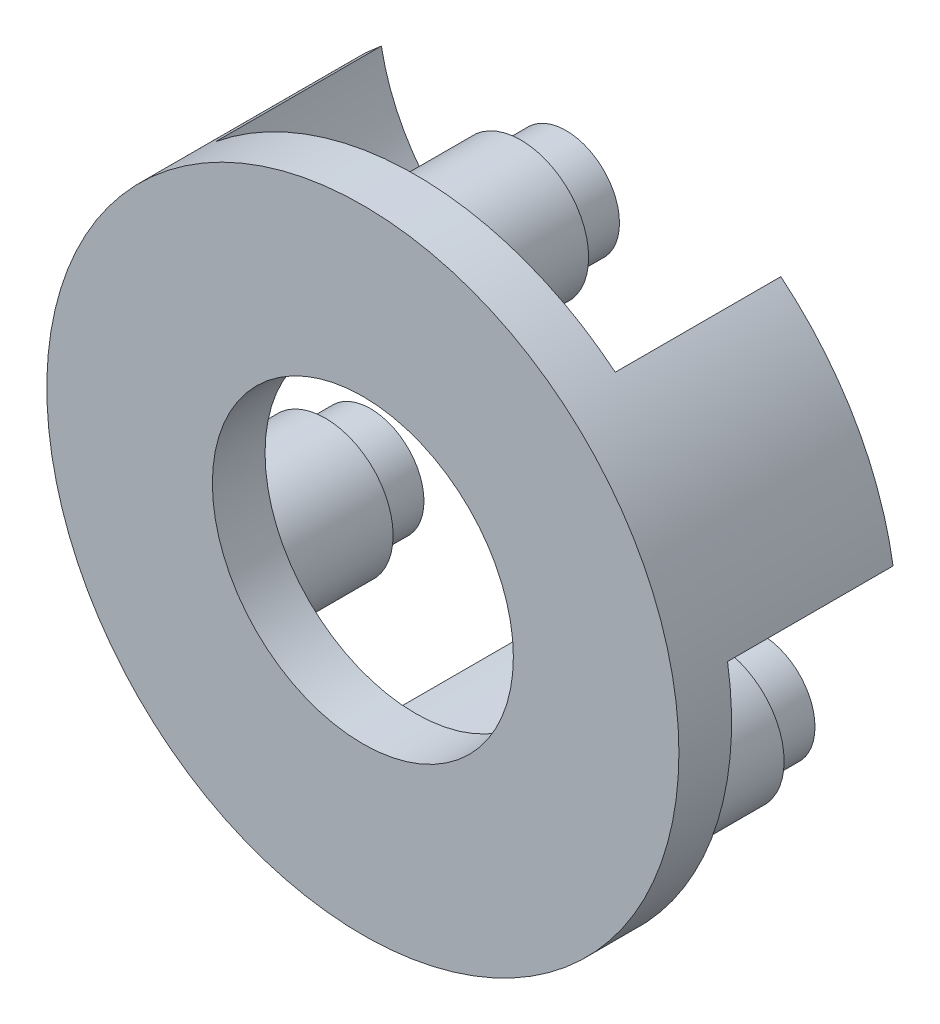
ISO-10303-21;
HEADER;
FILE_DESCRIPTION(('STEP AP214'),'2;1');
FILE_NAME('part.step','',(''),(''),'','','');
FILE_SCHEMA(('AUTOMOTIVE_DESIGN { 1 0 10303 214 1 1 1 1 }'));
ENDSEC;
DATA;
#1=APPLICATION_CONTEXT('core data for automotive mechanical design processes');
#2=APPLICATION_PROTOCOL_DEFINITION('international standard','automotive_design',2000,#1);
#3=PRODUCT_CONTEXT('',#1,'mechanical');
#4=PRODUCT('Part','Part','',(#3));
#5=PRODUCT_RELATED_PRODUCT_CATEGORY('part','',(#4));
#6=PRODUCT_DEFINITION_FORMATION('','',#4);
#7=PRODUCT_DEFINITION_CONTEXT('part definition',#1,'design');
#8=PRODUCT_DEFINITION('design','',#6,#7);
#9=PRODUCT_DEFINITION_SHAPE('','',#8);
#10=(LENGTH_UNIT() NAMED_UNIT(*) SI_UNIT(.MILLI.,.METRE.));
#11=(NAMED_UNIT(*) PLANE_ANGLE_UNIT() SI_UNIT($,.RADIAN.));
#12=(NAMED_UNIT(*) SI_UNIT($,.STERADIAN.) SOLID_ANGLE_UNIT());
#13=UNCERTAINTY_MEASURE_WITH_UNIT(LENGTH_MEASURE(1.E-05),#10,'distance_accuracy_value','');
#14=(GEOMETRIC_REPRESENTATION_CONTEXT(3) GLOBAL_UNCERTAINTY_ASSIGNED_CONTEXT((#13)) GLOBAL_UNIT_ASSIGNED_CONTEXT((#10,
#11,#12)) REPRESENTATION_CONTEXT('',''));
#15=CARTESIAN_POINT('',(0.,0.,0.));
#16=DIRECTION('',(0.,0.,1.));
#17=DIRECTION('',(1.,0.,0.));
#18=AXIS2_PLACEMENT_3D('',#15,#16,#17);
#19=CARTESIAN_POINT('',(0.,0.,0.));
#20=DIRECTION('',(0.,0.,1.));
#21=DIRECTION('',(1.,0.,0.));
#22=AXIS2_PLACEMENT_3D('',#19,#20,#21);
#23=PLANE('',#22);
#24=CARTESIAN_POINT('',(12.9903810567656,-7.50000000000055,0.));
#25=DIRECTION('',(0.,0.,1.));
#26=DIRECTION('',(1.,0.,0.));
#27=AXIS2_PLACEMENT_3D('',#24,#25,#26);
#28=CIRCLE('',#27,4.5000000000012);
#29=CARTESIAN_POINT('',(17.4903810567668,-7.50000000000055,0.));
#30=VERTEX_POINT('',#29);
#31=EDGE_CURVE('E11',#30,#30,#28,.F.);
#32=ORIENTED_EDGE('',*,*,#31,.F.);
#33=EDGE_LOOP('',(#32));
#34=FACE_BOUND('',#33,.T.);
#35=CARTESIAN_POINT('',(-12.9903810567675,-7.49999999999945,0.));
#36=DIRECTION('',(0.,0.,1.));
#37=DIRECTION('',(1.,0.,0.));
#38=AXIS2_PLACEMENT_3D('',#35,#36,#37);
#39=CIRCLE('',#38,4.50000000000082);
#40=CARTESIAN_POINT('',(-8.49038105676671,-7.49999999999945,0.));
#41=VERTEX_POINT('',#40);
#42=EDGE_CURVE('E246',#41,#41,#39,.F.);
#43=ORIENTED_EDGE('',*,*,#42,.F.);
#44=EDGE_LOOP('',(#43));
#45=FACE_BOUND('',#44,.T.);
#46=CARTESIAN_POINT('',(0.,15.,0.));
#47=DIRECTION('',(0.,0.,1.));
#48=DIRECTION('',(1.,0.,0.));
#49=AXIS2_PLACEMENT_3D('',#46,#47,#48);
#50=CIRCLE('',#49,4.5);
#51=CARTESIAN_POINT('',(4.5,15.,0.));
#52=VERTEX_POINT('',#51);
#53=EDGE_CURVE('E240',#52,#52,#50,.F.);
#54=ORIENTED_EDGE('',*,*,#53,.F.);
#55=EDGE_LOOP('',(#54));
#56=FACE_BOUND('',#55,.T.);
#57=CARTESIAN_POINT('',(0.,0.,0.));
#58=DIRECTION('',(0.,0.,-1.));
#59=DIRECTION('',(-1.,0.,0.));
#60=AXIS2_PLACEMENT_3D('',#57,#58,#59);
#61=CIRCLE('',#60,10.);
#62=CARTESIAN_POINT('',(-10.,0.,0.));
#63=VERTEX_POINT('',#62);
#64=EDGE_CURVE('E223',#63,#63,#61,.T.);
#65=ORIENTED_EDGE('',*,*,#64,.F.);
#66=EDGE_LOOP('',(#65));
#67=FACE_BOUND('',#66,.T.);
#68=CARTESIAN_POINT('',(0.,0.,0.));
#69=DIRECTION('',(0.,0.,-1.));
#70=DIRECTION('',(-1.,0.,0.));
#71=AXIS2_PLACEMENT_3D('',#68,#69,#70);
#72=CIRCLE('',#71,12.5);
#73=CARTESIAN_POINT('',(3.02191559121072,-12.1292219931699,0.));
#74=VERTEX_POINT('',#73);
#75=CARTESIAN_POINT('',(-3.02191559121221,-12.1292219931696,0.));
#76=VERTEX_POINT('',#75);
#77=EDGE_CURVE('E160',#74,#76,#72,.T.);
#78=ORIENTED_EDGE('',*,*,#77,.T.);
#79=CARTESIAN_POINT('',(-16.2379763209581,-9.37499999999878,0.));
#80=DIRECTION('',(0.,0.,-1.));
#81=DIRECTION('',(-1.,0.,0.));
#82=AXIS2_PLACEMENT_3D('',#79,#80,#81);
#83=CIRCLE('',#82,13.4999999999999);
#84=CARTESIAN_POINT('',(-7.45897050021628,-19.6306841214692,0.));
#85=VERTEX_POINT('',#84);
#86=EDGE_CURVE('E133',#76,#85,#83,.T.);
#87=ORIENTED_EDGE('',*,*,#86,.T.);
#88=CARTESIAN_POINT('',(0.,0.,0.));
#89=DIRECTION('',(0.,0.,1.));
#90=DIRECTION('',(1.,0.,0.));
#91=AXIS2_PLACEMENT_3D('',#88,#89,#90);
#92=CIRCLE('',#91,21.);
#93=CARTESIAN_POINT('',(-20.7301563929679,3.35568412147083,0.));
#94=VERTEX_POINT('',#93);
#95=EDGE_CURVE('E237',#94,#85,#92,.T.);
#96=ORIENTED_EDGE('',*,*,#95,.F.);
#97=CARTESIAN_POINT('',(-16.2379763209581,-9.37499999999878,0.));
#98=DIRECTION('',(0.,0.,-1.));
#99=DIRECTION('',(-1.,0.,0.));
#100=AXIS2_PLACEMENT_3D('',#97,#98,#99);
#101=CIRCLE('',#100,13.5);
#102=CARTESIAN_POINT('',(-12.0151721698315,3.44755532650412,0.));
#103=VERTEX_POINT('',#102);
#104=EDGE_CURVE('E62',#94,#103,#101,.T.);
#105=ORIENTED_EDGE('',*,*,#104,.T.);
#106=CARTESIAN_POINT('',(0.,0.,0.));
#107=DIRECTION('',(0.,0.,-1.));
#108=DIRECTION('',(-1.,0.,0.));
#109=AXIS2_PLACEMENT_3D('',#106,#107,#108);
#110=CIRCLE('',#109,12.5);
#111=CARTESIAN_POINT('',(-8.99325657861968,8.68166666666682,0.));
#112=VERTEX_POINT('',#111);
#113=EDGE_CURVE('E182',#103,#112,#110,.T.);
#114=ORIENTED_EDGE('',*,*,#113,.T.);
#115=CARTESIAN_POINT('',(1.09807996029332E-12,18.7499999999993,0.));
#116=DIRECTION('',(0.,0.,-1.));
#117=DIRECTION('',(-1.,0.,0.));
#118=AXIS2_PLACEMENT_3D('',#115,#116,#117);
#119=CIRCLE('',#118,13.5);
#120=CARTESIAN_POINT('',(-13.2711858927519,16.2750000000007,0.));
#121=VERTEX_POINT('',#120);
#122=EDGE_CURVE('E138',#112,#121,#119,.T.);
#123=ORIENTED_EDGE('',*,*,#122,.T.);
#124=CARTESIAN_POINT('',(13.2711858927538,16.2749999999991,0.));
#125=VERTEX_POINT('',#124);
#126=EDGE_CURVE('E234',#125,#121,#92,.T.);
#127=ORIENTED_EDGE('',*,*,#126,.F.);
#128=CARTESIAN_POINT('',(1.09807996029332E-12,18.7499999999993,0.));
#129=DIRECTION('',(0.,0.,-1.));
#130=DIRECTION('',(-1.,0.,0.));
#131=AXIS2_PLACEMENT_3D('',#128,#129,#130);
#132=CIRCLE('',#131,13.5);
#133=CARTESIAN_POINT('',(8.9932565786207,8.68166666666577,0.));
#134=VERTEX_POINT('',#133);
#135=EDGE_CURVE('E198',#125,#134,#132,.T.);
#136=ORIENTED_EDGE('',*,*,#135,.T.);
#137=CARTESIAN_POINT('',(0.,0.,0.));
#138=DIRECTION('',(0.,0.,-1.));
#139=DIRECTION('',(-1.,0.,0.));
#140=AXIS2_PLACEMENT_3D('',#137,#138,#139);
#141=CIRCLE('',#140,12.5);
#142=CARTESIAN_POINT('',(12.0151721698319,3.4475553265027,0.));
#143=VERTEX_POINT('',#142);
#144=EDGE_CURVE('E209',#134,#143,#141,.T.);
#145=ORIENTED_EDGE('',*,*,#144,.T.);
#146=CARTESIAN_POINT('',(16.237976320957,-9.37500000000068,0.));
#147=DIRECTION('',(0.,0.,-1.));
#148=DIRECTION('',(-1.,0.,0.));
#149=AXIS2_PLACEMENT_3D('',#146,#147,#148);
#150=CIRCLE('',#149,13.5);
#151=CARTESIAN_POINT('',(20.7301563929683,3.35568412146838,0.));
#152=VERTEX_POINT('',#151);
#153=EDGE_CURVE('E193',#143,#152,#150,.T.);
#154=ORIENTED_EDGE('',*,*,#153,.T.);
#155=CARTESIAN_POINT('',(7.45897050021399,-19.6306841214701,0.));
#156=VERTEX_POINT('',#155);
#157=EDGE_CURVE('E229',#156,#152,#92,.T.);
#158=ORIENTED_EDGE('',*,*,#157,.F.);
#159=CARTESIAN_POINT('',(16.237976320957,-9.37500000000068,0.));
#160=DIRECTION('',(0.,0.,-1.));
#161=DIRECTION('',(-1.,0.,0.));
#162=AXIS2_PLACEMENT_3D('',#159,#160,#161);
#163=CIRCLE('',#162,13.5);
#164=EDGE_CURVE('E54',#156,#74,#163,.T.);
#165=ORIENTED_EDGE('',*,*,#164,.T.);
#166=EDGE_LOOP('',(#78,#87,#96,#105,#114,#123,#127,#136,#145,#154,#158,#165));
#167=FACE_BOUND('',#166,.T.);
#168=ADVANCED_FACE('F39',(#34,#45,#56,#67,#167),#23,.F.);
#169=CARTESIAN_POINT('',(0.,0.,3.5));
#170=DIRECTION('',(0.,0.,-1.));
#171=DIRECTION('',(-1.,0.,0.));
#172=AXIS2_PLACEMENT_3D('',#169,#170,#171);
#173=CYLINDRICAL_SURFACE('',#172,21.);
#174=CARTESIAN_POINT('',(0.,0.,3.5));
#175=DIRECTION('',(0.,0.,1.));
#176=DIRECTION('',(1.,0.,0.));
#177=AXIS2_PLACEMENT_3D('',#174,#175,#176);
#178=CIRCLE('',#177,21.);
#179=CARTESIAN_POINT('',(21.,0.,3.5));
#180=VERTEX_POINT('',#179);
#181=EDGE_CURVE('E230',#180,#180,#178,.T.);
#182=ORIENTED_EDGE('',*,*,#181,.F.);
#183=EDGE_LOOP('',(#182));
#184=FACE_BOUND('',#183,.T.);
#185=ORIENTED_EDGE('',*,*,#126,.T.);
#186=DIRECTION('',(0.,0.,1.));
#187=VECTOR('',#186,1.);
#188=CARTESIAN_POINT('',(-13.2711858927519,16.2750000000007,-11.));
#189=LINE('',#188,#187);
#190=CARTESIAN_POINT('',(-13.2711858927519,16.2750000000007,-11.));
#191=VERTEX_POINT('',#190);
#192=EDGE_CURVE('E179',#191,#121,#189,.T.);
#193=ORIENTED_EDGE('',*,*,#192,.F.);
#194=CARTESIAN_POINT('',(0.,0.,-11.));
#195=DIRECTION('',(0.,0.,-1.));
#196=DIRECTION('',(-1.,0.,0.));
#197=AXIS2_PLACEMENT_3D('',#194,#195,#196);
#198=CIRCLE('',#197,21.);
#199=CARTESIAN_POINT('',(-20.7301563929679,3.35568412147083,-11.));
#200=VERTEX_POINT('',#199);
#201=EDGE_CURVE('E177',#200,#191,#198,.T.);
#202=ORIENTED_EDGE('',*,*,#201,.F.);
#203=DIRECTION('',(0.,0.,1.));
#204=VECTOR('',#203,1.);
#205=CARTESIAN_POINT('',(-20.7301563929679,3.35568412147083,-11.));
#206=LINE('',#205,#204);
#207=EDGE_CURVE('E187',#200,#94,#206,.T.);
#208=ORIENTED_EDGE('',*,*,#207,.T.);
#209=ORIENTED_EDGE('',*,*,#95,.T.);
#210=DIRECTION('',(0.,0.,1.));
#211=VECTOR('',#210,1.);
#212=CARTESIAN_POINT('',(-7.45897050021628,-19.6306841214692,-11.));
#213=LINE('',#212,#211);
#214=CARTESIAN_POINT('',(-7.45897050021628,-19.6306841214692,-11.));
#215=VERTEX_POINT('',#214);
#216=EDGE_CURVE('E158',#215,#85,#213,.T.);
#217=ORIENTED_EDGE('',*,*,#216,.F.);
#218=CARTESIAN_POINT('',(0.,0.,-11.));
#219=DIRECTION('',(0.,0.,-1.));
#220=DIRECTION('',(-1.,0.,0.));
#221=AXIS2_PLACEMENT_3D('',#218,#219,#220);
#222=CIRCLE('',#221,21.);
#223=CARTESIAN_POINT('',(7.45897050021399,-19.6306841214701,-11.));
#224=VERTEX_POINT('',#223);
#225=EDGE_CURVE('E148',#224,#215,#222,.T.);
#226=ORIENTED_EDGE('',*,*,#225,.F.);
#227=DIRECTION('',(0.,0.,1.));
#228=VECTOR('',#227,1.);
#229=CARTESIAN_POINT('',(7.45897050021399,-19.6306841214701,-11.));
#230=LINE('',#229,#228);
#231=EDGE_CURVE('E165',#224,#156,#230,.T.);
#232=ORIENTED_EDGE('',*,*,#231,.T.);
#233=ORIENTED_EDGE('',*,*,#157,.T.);
#234=DIRECTION('',(0.,0.,1.));
#235=VECTOR('',#234,1.);
#236=CARTESIAN_POINT('',(20.7301563929683,3.35568412146838,-11.));
#237=LINE('',#236,#235);
#238=CARTESIAN_POINT('',(20.7301563929683,3.35568412146838,-11.));
#239=VERTEX_POINT('',#238);
#240=EDGE_CURVE('E206',#239,#152,#237,.T.);
#241=ORIENTED_EDGE('',*,*,#240,.F.);
#242=CARTESIAN_POINT('',(0.,0.,-11.));
#243=DIRECTION('',(0.,0.,-1.));
#244=DIRECTION('',(-1.,0.,0.));
#245=AXIS2_PLACEMENT_3D('',#242,#243,#244);
#246=CIRCLE('',#245,21.);
#247=CARTESIAN_POINT('',(13.2711858927538,16.2749999999991,-11.));
#248=VERTEX_POINT('',#247);
#249=EDGE_CURVE('E204',#248,#239,#246,.T.);
#250=ORIENTED_EDGE('',*,*,#249,.F.);
#251=DIRECTION('',(0.,0.,1.));
#252=VECTOR('',#251,1.);
#253=CARTESIAN_POINT('',(13.2711858927538,16.2749999999991,-11.));
#254=LINE('',#253,#252);
#255=EDGE_CURVE('E216',#248,#125,#254,.T.);
#256=ORIENTED_EDGE('',*,*,#255,.T.);
#257=EDGE_LOOP('',(#185,#193,#202,#208,#209,#217,#226,#232,#233,#241,#250,#256));
#258=FACE_BOUND('',#257,.T.);
#259=ADVANCED_FACE('F41',(#184,#258),#173,.T.);
#260=CARTESIAN_POINT('',(0.,0.,3.5));
#261=DIRECTION('',(0.,0.,1.));
#262=DIRECTION('',(1.,0.,0.));
#263=AXIS2_PLACEMENT_3D('',#260,#261,#262);
#264=PLANE('',#263);
#265=CARTESIAN_POINT('',(0.,0.,3.5));
#266=DIRECTION('',(0.,0.,1.));
#267=DIRECTION('',(1.,0.,0.));
#268=AXIS2_PLACEMENT_3D('',#265,#266,#267);
#269=CIRCLE('',#268,10.);
#270=CARTESIAN_POINT('',(10.,0.,3.5));
#271=VERTEX_POINT('',#270);
#272=EDGE_CURVE('E226',#271,#271,#269,.T.);
#273=ORIENTED_EDGE('',*,*,#272,.F.);
#274=EDGE_LOOP('',(#273));
#275=FACE_BOUND('',#274,.T.);
#276=ORIENTED_EDGE('',*,*,#181,.T.);
#277=EDGE_LOOP('',(#276));
#278=FACE_BOUND('',#277,.T.);
#279=ADVANCED_FACE('F352',(#275,#278),#264,.T.);
#280=CARTESIAN_POINT('',(0.,0.,8.2));
#281=DIRECTION('',(0.,0.,-1.));
#282=DIRECTION('',(-1.,0.,0.));
#283=AXIS2_PLACEMENT_3D('',#280,#281,#282);
#284=CYLINDRICAL_SURFACE('',#283,10.);
#285=ORIENTED_EDGE('',*,*,#272,.T.);
#286=EDGE_LOOP('',(#285));
#287=FACE_BOUND('',#286,.T.);
#288=ORIENTED_EDGE('',*,*,#64,.T.);
#289=EDGE_LOOP('',(#288));
#290=FACE_BOUND('',#289,.T.);
#291=ADVANCED_FACE('F359',(#287,#290),#284,.F.);
#292=CARTESIAN_POINT('',(16.237976320957,-9.37500000000068,-11.));
#293=DIRECTION('',(0.,0.,1.));
#294=DIRECTION('',(1.,0.,0.));
#295=AXIS2_PLACEMENT_3D('',#292,#293,#294);
#296=CYLINDRICAL_SURFACE('',#295,13.5);
#297=ORIENTED_EDGE('',*,*,#153,.F.);
#298=DIRECTION('',(0.,0.,1.));
#299=VECTOR('',#298,1.);
#300=CARTESIAN_POINT('',(12.0151721698319,3.4475553265027,-11.));
#301=LINE('',#300,#299);
#302=CARTESIAN_POINT('',(12.0151721698319,3.4475553265027,-11.));
#303=VERTEX_POINT('',#302);
#304=EDGE_CURVE('E220',#303,#143,#301,.T.);
#305=ORIENTED_EDGE('',*,*,#304,.F.);
#306=CARTESIAN_POINT('',(16.237976320957,-9.37500000000068,-11.));
#307=DIRECTION('',(0.,0.,-1.));
#308=DIRECTION('',(-1.,0.,0.));
#309=AXIS2_PLACEMENT_3D('',#306,#307,#308);
#310=CIRCLE('',#309,13.5);
#311=EDGE_CURVE('E194',#303,#239,#310,.T.);
#312=ORIENTED_EDGE('',*,*,#311,.T.);
#313=ORIENTED_EDGE('',*,*,#240,.T.);
#314=EDGE_LOOP('',(#297,#305,#312,#313));
#315=FACE_BOUND('',#314,.T.);
#316=ADVANCED_FACE('F319',(#315),#296,.F.);
#317=CARTESIAN_POINT('',(0.,0.,-11.));
#318=DIRECTION('',(0.,0.,1.));
#319=DIRECTION('',(1.,0.,0.));
#320=AXIS2_PLACEMENT_3D('',#317,#318,#319);
#321=CYLINDRICAL_SURFACE('',#320,12.5);
#322=ORIENTED_EDGE('',*,*,#144,.F.);
#323=DIRECTION('',(0.,0.,1.));
#324=VECTOR('',#323,1.);
#325=CARTESIAN_POINT('',(8.9932565786207,8.68166666666577,-11.));
#326=LINE('',#325,#324);
#327=CARTESIAN_POINT('',(8.9932565786207,8.68166666666577,-11.));
#328=VERTEX_POINT('',#327);
#329=EDGE_CURVE('E218',#328,#134,#326,.T.);
#330=ORIENTED_EDGE('',*,*,#329,.F.);
#331=CARTESIAN_POINT('',(0.,0.,-11.));
#332=DIRECTION('',(0.,0.,-1.));
#333=DIRECTION('',(-1.,0.,0.));
#334=AXIS2_PLACEMENT_3D('',#331,#332,#333);
#335=CIRCLE('',#334,12.5);
#336=EDGE_CURVE('E197',#328,#303,#335,.T.);
#337=ORIENTED_EDGE('',*,*,#336,.T.);
#338=ORIENTED_EDGE('',*,*,#304,.T.);
#339=EDGE_LOOP('',(#322,#330,#337,#338));
#340=FACE_BOUND('',#339,.T.);
#341=ADVANCED_FACE('F313',(#340),#321,.F.);
#342=CARTESIAN_POINT('',(1.09807996029332E-12,18.7499999999993,-11.));
#343=DIRECTION('',(0.,0.,1.));
#344=DIRECTION('',(1.,0.,0.));
#345=AXIS2_PLACEMENT_3D('',#342,#343,#344);
#346=CYLINDRICAL_SURFACE('',#345,13.5);
#347=ORIENTED_EDGE('',*,*,#135,.F.);
#348=ORIENTED_EDGE('',*,*,#255,.F.);
#349=CARTESIAN_POINT('',(1.09807996029332E-12,18.7499999999993,-11.));
#350=DIRECTION('',(0.,0.,-1.));
#351=DIRECTION('',(-1.,0.,0.));
#352=AXIS2_PLACEMENT_3D('',#349,#350,#351);
#353=CIRCLE('',#352,13.5);
#354=EDGE_CURVE('E201',#248,#328,#353,.T.);
#355=ORIENTED_EDGE('',*,*,#354,.T.);
#356=ORIENTED_EDGE('',*,*,#329,.T.);
#357=EDGE_LOOP('',(#347,#348,#355,#356));
#358=FACE_BOUND('',#357,.T.);
#359=ADVANCED_FACE('F303',(#358),#346,.F.);
#360=CARTESIAN_POINT('',(0.,0.,-11.));
#361=DIRECTION('',(0.,0.,-1.));
#362=DIRECTION('',(-1.,0.,0.));
#363=AXIS2_PLACEMENT_3D('',#360,#361,#362);
#364=PLANE('',#363);
#365=CARTESIAN_POINT('',(13.8564064605515,7.99999999999844,-11.));
#366=DIRECTION('',(0.,0.,-1.));
#367=DIRECTION('',(-1.,0.,0.));
#368=AXIS2_PLACEMENT_3D('',#365,#366,#367);
#369=CIRCLE('',#368,1.50000000000057);
#370=CARTESIAN_POINT('',(12.3564064605509,7.99999999999844,-11.));
#371=VERTEX_POINT('',#370);
#372=EDGE_CURVE('E285',#371,#371,#369,.T.);
#373=ORIENTED_EDGE('',*,*,#372,.F.);
#374=EDGE_LOOP('',(#373));
#375=FACE_BOUND('',#374,.T.);
#376=ORIENTED_EDGE('',*,*,#311,.F.);
#377=ORIENTED_EDGE('',*,*,#336,.F.);
#378=ORIENTED_EDGE('',*,*,#354,.F.);
#379=ORIENTED_EDGE('',*,*,#249,.T.);
#380=EDGE_LOOP('',(#376,#377,#378,#379));
#381=FACE_BOUND('',#380,.T.);
#382=ADVANCED_FACE('F299',(#375,#381),#364,.T.);
#383=CARTESIAN_POINT('',(1.09807996029332E-12,18.7499999999993,-11.));
#384=DIRECTION('',(0.,0.,1.));
#385=DIRECTION('',(1.,0.,0.));
#386=AXIS2_PLACEMENT_3D('',#383,#384,#385);
#387=CYLINDRICAL_SURFACE('',#386,13.5);
#388=ORIENTED_EDGE('',*,*,#122,.F.);
#389=DIRECTION('',(0.,0.,1.));
#390=VECTOR('',#389,1.);
#391=CARTESIAN_POINT('',(-8.99325657861968,8.68166666666682,-11.));
#392=LINE('',#391,#390);
#393=CARTESIAN_POINT('',(-8.99325657861968,8.68166666666682,-11.));
#394=VERTEX_POINT('',#393);
#395=EDGE_CURVE('E191',#394,#112,#392,.T.);
#396=ORIENTED_EDGE('',*,*,#395,.F.);
#397=CARTESIAN_POINT('',(1.09807996029332E-12,18.7499999999993,-11.));
#398=DIRECTION('',(0.,0.,-1.));
#399=DIRECTION('',(-1.,0.,0.));
#400=AXIS2_PLACEMENT_3D('',#397,#398,#399);
#401=CIRCLE('',#400,13.5);
#402=EDGE_CURVE('E168',#394,#191,#401,.T.);
#403=ORIENTED_EDGE('',*,*,#402,.T.);
#404=ORIENTED_EDGE('',*,*,#192,.T.);
#405=EDGE_LOOP('',(#388,#396,#403,#404));
#406=FACE_BOUND('',#405,.T.);
#407=ADVANCED_FACE('F302',(#406),#387,.F.);
#408=CARTESIAN_POINT('',(0.,0.,-11.));
#409=DIRECTION('',(0.,0.,1.));
#410=DIRECTION('',(1.,0.,0.));
#411=AXIS2_PLACEMENT_3D('',#408,#409,#410);
#412=CYLINDRICAL_SURFACE('',#411,12.5);
#413=ORIENTED_EDGE('',*,*,#113,.F.);
#414=DIRECTION('',(0.,0.,1.));
#415=VECTOR('',#414,1.);
#416=CARTESIAN_POINT('',(-12.0151721698315,3.44755532650412,-11.));
#417=LINE('',#416,#415);
#418=CARTESIAN_POINT('',(-12.0151721698315,3.44755532650412,-11.));
#419=VERTEX_POINT('',#418);
#420=EDGE_CURVE('E189',#419,#103,#417,.T.);
#421=ORIENTED_EDGE('',*,*,#420,.F.);
#422=CARTESIAN_POINT('',(0.,0.,-11.));
#423=DIRECTION('',(0.,0.,-1.));
#424=DIRECTION('',(-1.,0.,0.));
#425=AXIS2_PLACEMENT_3D('',#422,#423,#424);
#426=CIRCLE('',#425,12.5);
#427=EDGE_CURVE('E171',#419,#394,#426,.T.);
#428=ORIENTED_EDGE('',*,*,#427,.T.);
#429=ORIENTED_EDGE('',*,*,#395,.T.);
#430=EDGE_LOOP('',(#413,#421,#428,#429));
#431=FACE_BOUND('',#430,.T.);
#432=ADVANCED_FACE('F332',(#431),#412,.F.);
#433=CARTESIAN_POINT('',(-16.2379763209581,-9.37499999999878,-11.));
#434=DIRECTION('',(0.,0.,1.));
#435=DIRECTION('',(1.,0.,0.));
#436=AXIS2_PLACEMENT_3D('',#433,#434,#435);
#437=CYLINDRICAL_SURFACE('',#436,13.5);
#438=ORIENTED_EDGE('',*,*,#104,.F.);
#439=ORIENTED_EDGE('',*,*,#207,.F.);
#440=CARTESIAN_POINT('',(-16.2379763209581,-9.37499999999878,-11.));
#441=DIRECTION('',(0.,0.,-1.));
#442=DIRECTION('',(-1.,0.,0.));
#443=AXIS2_PLACEMENT_3D('',#440,#441,#442);
#444=CIRCLE('',#443,13.5);
#445=EDGE_CURVE('E174',#200,#419,#444,.T.);
#446=ORIENTED_EDGE('',*,*,#445,.T.);
#447=ORIENTED_EDGE('',*,*,#420,.T.);
#448=EDGE_LOOP('',(#438,#439,#446,#447));
#449=FACE_BOUND('',#448,.T.);
#450=ADVANCED_FACE('F333',(#449),#437,.F.);
#451=CARTESIAN_POINT('',(0.,0.,-11.));
#452=DIRECTION('',(0.,0.,-1.));
#453=DIRECTION('',(-1.,0.,0.));
#454=AXIS2_PLACEMENT_3D('',#451,#452,#453);
#455=PLANE('',#454);
#456=CARTESIAN_POINT('',(-13.8564064605506,8.00000000000078,-11.));
#457=DIRECTION('',(0.,0.,-1.));
#458=DIRECTION('',(-1.,0.,0.));
#459=AXIS2_PLACEMENT_3D('',#456,#457,#458);
#460=CIRCLE('',#459,1.5);
#461=CARTESIAN_POINT('',(-15.3564064605506,8.00000000000078,-11.));
#462=VERTEX_POINT('',#461);
#463=EDGE_CURVE('E276',#462,#462,#460,.T.);
#464=ORIENTED_EDGE('',*,*,#463,.F.);
#465=EDGE_LOOP('',(#464));
#466=FACE_BOUND('',#465,.T.);
#467=ORIENTED_EDGE('',*,*,#402,.F.);
#468=ORIENTED_EDGE('',*,*,#427,.F.);
#469=ORIENTED_EDGE('',*,*,#445,.F.);
#470=ORIENTED_EDGE('',*,*,#201,.T.);
#471=EDGE_LOOP('',(#467,#468,#469,#470));
#472=FACE_BOUND('',#471,.T.);
#473=ADVANCED_FACE('F329',(#466,#472),#455,.T.);
#474=CARTESIAN_POINT('',(-16.2379763209581,-9.37499999999878,-11.));
#475=DIRECTION('',(0.,0.,1.));
#476=DIRECTION('',(1.,0.,0.));
#477=AXIS2_PLACEMENT_3D('',#474,#475,#476);
#478=CYLINDRICAL_SURFACE('',#477,13.4999999999999);
#479=ORIENTED_EDGE('',*,*,#86,.F.);
#480=DIRECTION('',(0.,0.,1.));
#481=VECTOR('',#480,1.);
#482=CARTESIAN_POINT('',(-3.02191559121221,-12.1292219931696,-11.));
#483=LINE('',#482,#481);
#484=CARTESIAN_POINT('',(-3.02191559121221,-12.1292219931696,-11.));
#485=VERTEX_POINT('',#484);
#486=EDGE_CURVE('E128',#485,#76,#483,.T.);
#487=ORIENTED_EDGE('',*,*,#486,.F.);
#488=CARTESIAN_POINT('',(-16.2379763209581,-9.37499999999878,-11.));
#489=DIRECTION('',(0.,0.,-1.));
#490=DIRECTION('',(-1.,0.,0.));
#491=AXIS2_PLACEMENT_3D('',#488,#489,#490);
#492=CIRCLE('',#491,13.4999999999999);
#493=EDGE_CURVE('E131',#485,#215,#492,.T.);
#494=ORIENTED_EDGE('',*,*,#493,.T.);
#495=ORIENTED_EDGE('',*,*,#216,.T.);
#496=EDGE_LOOP('',(#479,#487,#494,#495));
#497=FACE_BOUND('',#496,.T.);
#498=ADVANCED_FACE('F130',(#497),#478,.F.);
#499=CARTESIAN_POINT('',(0.,0.,-11.));
#500=DIRECTION('',(0.,0.,1.));
#501=DIRECTION('',(1.,0.,0.));
#502=AXIS2_PLACEMENT_3D('',#499,#500,#501);
#503=CYLINDRICAL_SURFACE('',#502,12.5);
#504=ORIENTED_EDGE('',*,*,#77,.F.);
#505=DIRECTION('',(0.,0.,1.));
#506=VECTOR('',#505,1.);
#507=CARTESIAN_POINT('',(3.02191559121072,-12.1292219931699,-11.));
#508=LINE('',#507,#506);
#509=CARTESIAN_POINT('',(3.02191559121072,-12.1292219931699,-11.));
#510=VERTEX_POINT('',#509);
#511=EDGE_CURVE('E139',#510,#74,#508,.T.);
#512=ORIENTED_EDGE('',*,*,#511,.F.);
#513=CARTESIAN_POINT('',(0.,0.,-11.));
#514=DIRECTION('',(0.,0.,-1.));
#515=DIRECTION('',(-1.,0.,0.));
#516=AXIS2_PLACEMENT_3D('',#513,#514,#515);
#517=CIRCLE('',#516,12.5);
#518=EDGE_CURVE('E145',#510,#485,#517,.T.);
#519=ORIENTED_EDGE('',*,*,#518,.T.);
#520=ORIENTED_EDGE('',*,*,#486,.T.);
#521=EDGE_LOOP('',(#504,#512,#519,#520));
#522=FACE_BOUND('',#521,.T.);
#523=ADVANCED_FACE('F151',(#522),#503,.F.);
#524=CARTESIAN_POINT('',(16.237976320957,-9.37500000000068,-11.));
#525=DIRECTION('',(0.,0.,1.));
#526=DIRECTION('',(1.,0.,0.));
#527=AXIS2_PLACEMENT_3D('',#524,#525,#526);
#528=CYLINDRICAL_SURFACE('',#527,13.5);
#529=ORIENTED_EDGE('',*,*,#164,.F.);
#530=ORIENTED_EDGE('',*,*,#231,.F.);
#531=CARTESIAN_POINT('',(16.237976320957,-9.37500000000068,-11.));
#532=DIRECTION('',(0.,0.,-1.));
#533=DIRECTION('',(-1.,0.,0.));
#534=AXIS2_PLACEMENT_3D('',#531,#532,#533);
#535=CIRCLE('',#534,13.5);
#536=EDGE_CURVE('E152',#224,#510,#535,.T.);
#537=ORIENTED_EDGE('',*,*,#536,.T.);
#538=ORIENTED_EDGE('',*,*,#511,.T.);
#539=EDGE_LOOP('',(#529,#530,#537,#538));
#540=FACE_BOUND('',#539,.T.);
#541=ADVANCED_FACE('F336',(#540),#528,.F.);
#542=CARTESIAN_POINT('',(0.,0.,-11.));
#543=DIRECTION('',(0.,0.,-1.));
#544=DIRECTION('',(-1.,0.,0.));
#545=AXIS2_PLACEMENT_3D('',#542,#543,#544);
#546=PLANE('',#545);
#547=CARTESIAN_POINT('',(-1.58372237557348E-12,-16.0000000000004,-11.));
#548=DIRECTION('',(0.,0.,-1.));
#549=DIRECTION('',(-1.,0.,0.));
#550=AXIS2_PLACEMENT_3D('',#547,#548,#549);
#551=CIRCLE('',#550,1.4999999999998);
#552=CARTESIAN_POINT('',(-1.50000000000138,-16.0000000000004,-11.));
#553=VERTEX_POINT('',#552);
#554=EDGE_CURVE('E279',#553,#553,#551,.T.);
#555=ORIENTED_EDGE('',*,*,#554,.F.);
#556=EDGE_LOOP('',(#555));
#557=FACE_BOUND('',#556,.T.);
#558=ORIENTED_EDGE('',*,*,#493,.F.);
#559=ORIENTED_EDGE('',*,*,#518,.F.);
#560=ORIENTED_EDGE('',*,*,#536,.F.);
#561=ORIENTED_EDGE('',*,*,#225,.T.);
#562=EDGE_LOOP('',(#558,#559,#560,#561));
#563=FACE_BOUND('',#562,.T.);
#564=ADVANCED_FACE('F143',(#557,#563),#546,.T.);
#565=CARTESIAN_POINT('',(-1.58372237557348E-12,-16.0000000000004,-6.));
#566=DIRECTION('',(0.,0.,-1.));
#567=DIRECTION('',(-1.,0.,0.));
#568=AXIS2_PLACEMENT_3D('',#565,#566,#567);
#569=CYLINDRICAL_SURFACE('',#568,1.4999999999998);
#570=CARTESIAN_POINT('',(-1.58372237557348E-12,-16.0000000000004,-6.));
#571=DIRECTION('',(0.,0.,-1.));
#572=DIRECTION('',(-1.,0.,0.));
#573=AXIS2_PLACEMENT_3D('',#570,#571,#572);
#574=CIRCLE('',#573,1.4999999999998);
#575=CARTESIAN_POINT('',(-1.50000000000138,-16.0000000000004,-6.));
#576=VERTEX_POINT('',#575);
#577=EDGE_CURVE('E282',#576,#576,#574,.T.);
#578=ORIENTED_EDGE('',*,*,#577,.F.);
#579=EDGE_LOOP('',(#578));
#580=FACE_BOUND('',#579,.T.);
#581=ORIENTED_EDGE('',*,*,#554,.T.);
#582=EDGE_LOOP('',(#581));
#583=FACE_BOUND('',#582,.T.);
#584=ADVANCED_FACE('F343',(#580,#583),#569,.F.);
#585=CARTESIAN_POINT('',(-1.58372237557348E-12,-16.0000000000004,-6.));
#586=DIRECTION('',(0.,0.,-1.));
#587=DIRECTION('',(-1.,0.,0.));
#588=AXIS2_PLACEMENT_3D('',#585,#586,#587);
#589=PLANE('',#588);
#590=ORIENTED_EDGE('',*,*,#577,.T.);
#591=EDGE_LOOP('',(#590));
#592=FACE_BOUND('',#591,.T.);
#593=ADVANCED_FACE('F426',(#592),#589,.T.);
#594=CARTESIAN_POINT('',(-13.8564064605506,8.00000000000078,-6.));
#595=DIRECTION('',(0.,0.,-1.));
#596=DIRECTION('',(-1.,0.,0.));
#597=AXIS2_PLACEMENT_3D('',#594,#595,#596);
#598=CYLINDRICAL_SURFACE('',#597,1.5);
#599=CARTESIAN_POINT('',(-13.8564064605506,8.00000000000078,-6.));
#600=DIRECTION('',(0.,0.,-1.));
#601=DIRECTION('',(-1.,0.,0.));
#602=AXIS2_PLACEMENT_3D('',#599,#600,#601);
#603=CIRCLE('',#602,1.5);
#604=CARTESIAN_POINT('',(-15.3564064605506,8.00000000000078,-6.));
#605=VERTEX_POINT('',#604);
#606=EDGE_CURVE('E161',#605,#605,#603,.T.);
#607=ORIENTED_EDGE('',*,*,#606,.F.);
#608=EDGE_LOOP('',(#607));
#609=FACE_BOUND('',#608,.T.);
#610=ORIENTED_EDGE('',*,*,#463,.T.);
#611=EDGE_LOOP('',(#610));
#612=FACE_BOUND('',#611,.T.);
#613=ADVANCED_FACE('F437',(#609,#612),#598,.F.);
#614=CARTESIAN_POINT('',(-13.8564064605506,8.00000000000078,-6.));
#615=DIRECTION('',(0.,0.,-1.));
#616=DIRECTION('',(-1.,0.,0.));
#617=AXIS2_PLACEMENT_3D('',#614,#615,#616);
#618=PLANE('',#617);
#619=ORIENTED_EDGE('',*,*,#606,.T.);
#620=EDGE_LOOP('',(#619));
#621=FACE_BOUND('',#620,.T.);
#622=ADVANCED_FACE('F295',(#621),#618,.T.);
#623=CARTESIAN_POINT('',(13.8564064605515,7.99999999999844,-6.));
#624=DIRECTION('',(0.,0.,-1.));
#625=DIRECTION('',(-1.,0.,0.));
#626=AXIS2_PLACEMENT_3D('',#623,#624,#625);
#627=CYLINDRICAL_SURFACE('',#626,1.50000000000057);
#628=CARTESIAN_POINT('',(13.8564064605515,7.99999999999844,-6.));
#629=DIRECTION('',(0.,0.,-1.));
#630=DIRECTION('',(-1.,0.,0.));
#631=AXIS2_PLACEMENT_3D('',#628,#629,#630);
#632=CIRCLE('',#631,1.50000000000057);
#633=CARTESIAN_POINT('',(12.3564064605509,7.99999999999844,-6.));
#634=VERTEX_POINT('',#633);
#635=EDGE_CURVE('E267',#634,#634,#632,.T.);
#636=ORIENTED_EDGE('',*,*,#635,.F.);
#637=EDGE_LOOP('',(#636));
#638=FACE_BOUND('',#637,.T.);
#639=ORIENTED_EDGE('',*,*,#372,.T.);
#640=EDGE_LOOP('',(#639));
#641=FACE_BOUND('',#640,.T.);
#642=ADVANCED_FACE('F292',(#638,#641),#627,.F.);
#643=CARTESIAN_POINT('',(13.8564064605515,7.99999999999844,-6.));
#644=DIRECTION('',(0.,0.,-1.));
#645=DIRECTION('',(-1.,0.,0.));
#646=AXIS2_PLACEMENT_3D('',#643,#644,#645);
#647=PLANE('',#646);
#648=ORIENTED_EDGE('',*,*,#635,.T.);
#649=EDGE_LOOP('',(#648));
#650=FACE_BOUND('',#649,.T.);
#651=ADVANCED_FACE('F290',(#650),#647,.T.);
#652=CARTESIAN_POINT('',(0.,15.,-7.));
#653=DIRECTION('',(0.,0.,1.));
#654=DIRECTION('',(1.,0.,0.));
#655=AXIS2_PLACEMENT_3D('',#652,#653,#654);
#656=CYLINDRICAL_SURFACE('',#655,4.5);
#657=CARTESIAN_POINT('',(0.,15.,-7.));
#658=DIRECTION('',(0.,0.,-1.));
#659=DIRECTION('',(-1.,0.,0.));
#660=AXIS2_PLACEMENT_3D('',#657,#658,#659);
#661=CIRCLE('',#660,4.5);
#662=CARTESIAN_POINT('',(-4.5,15.,-7.));
#663=VERTEX_POINT('',#662);
#664=EDGE_CURVE('E270',#663,#663,#661,.T.);
#665=ORIENTED_EDGE('',*,*,#664,.F.);
#666=EDGE_LOOP('',(#665));
#667=FACE_BOUND('',#666,.T.);
#668=ORIENTED_EDGE('',*,*,#53,.T.);
#669=EDGE_LOOP('',(#668));
#670=FACE_BOUND('',#669,.T.);
#671=ADVANCED_FACE('F475',(#667,#670),#656,.T.);
#672=CARTESIAN_POINT('',(0.,15.,-7.));
#673=DIRECTION('',(0.,0.,-1.));
#674=DIRECTION('',(-1.,0.,0.));
#675=AXIS2_PLACEMENT_3D('',#672,#673,#674);
#676=PLANE('',#675);
#677=CARTESIAN_POINT('',(0.,15.,-7.));
#678=DIRECTION('',(0.,0.,-1.));
#679=DIRECTION('',(-1.,0.,0.));
#680=AXIS2_PLACEMENT_3D('',#677,#678,#679);
#681=CIRCLE('',#680,3.55);
#682=CARTESIAN_POINT('',(-3.55,15.,-7.));
#683=VERTEX_POINT('',#682);
#684=EDGE_CURVE('E233',#683,#683,#681,.F.);
#685=ORIENTED_EDGE('',*,*,#684,.T.);
#686=EDGE_LOOP('',(#685));
#687=FACE_BOUND('',#686,.T.);
#688=ORIENTED_EDGE('',*,*,#664,.T.);
#689=EDGE_LOOP('',(#688));
#690=FACE_BOUND('',#689,.T.);
#691=ADVANCED_FACE('F497',(#687,#690),#676,.T.);
#692=CARTESIAN_POINT('',(0.,15.,-10.));
#693=DIRECTION('',(0.,0.,1.));
#694=DIRECTION('',(1.,0.,0.));
#695=AXIS2_PLACEMENT_3D('',#692,#693,#694);
#696=PLANE('',#695);
#697=CARTESIAN_POINT('',(0.,15.,-10.));
#698=DIRECTION('',(0.,0.,1.));
#699=DIRECTION('',(1.,0.,0.));
#700=AXIS2_PLACEMENT_3D('',#697,#698,#699);
#701=CIRCLE('',#700,3.55);
#702=CARTESIAN_POINT('',(3.55,15.,-10.));
#703=VERTEX_POINT('',#702);
#704=EDGE_CURVE('E263',#703,#703,#701,.T.);
#705=ORIENTED_EDGE('',*,*,#704,.F.);
#706=EDGE_LOOP('',(#705));
#707=FACE_BOUND('',#706,.T.);
#708=ADVANCED_FACE('F491',(#707),#696,.F.);
#709=CARTESIAN_POINT('',(0.,15.,-10.));
#710=DIRECTION('',(0.,0.,1.));
#711=DIRECTION('',(1.,0.,0.));
#712=AXIS2_PLACEMENT_3D('',#709,#710,#711);
#713=CYLINDRICAL_SURFACE('',#712,3.55);
#714=ORIENTED_EDGE('',*,*,#684,.F.);
#715=EDGE_LOOP('',(#714));
#716=FACE_BOUND('',#715,.T.);
#717=ORIENTED_EDGE('',*,*,#704,.T.);
#718=EDGE_LOOP('',(#717));
#719=FACE_BOUND('',#718,.T.);
#720=ADVANCED_FACE('F496',(#716,#719),#713,.T.);
#721=CARTESIAN_POINT('',(-12.9903810567675,-7.49999999999945,-7.));
#722=DIRECTION('',(0.,0.,1.));
#723=DIRECTION('',(1.,0.,0.));
#724=AXIS2_PLACEMENT_3D('',#721,#722,#723);
#725=CYLINDRICAL_SURFACE('',#724,4.50000000000082);
#726=CARTESIAN_POINT('',(-12.9903810567675,-7.49999999999945,-7.));
#727=DIRECTION('',(0.,0.,-1.));
#728=DIRECTION('',(-1.,0.,0.));
#729=AXIS2_PLACEMENT_3D('',#726,#727,#728);
#730=CIRCLE('',#729,4.50000000000082);
#731=CARTESIAN_POINT('',(-17.4903810567684,-7.49999999999945,-7.));
#732=VERTEX_POINT('',#731);
#733=EDGE_CURVE('E735',#732,#732,#730,.T.);
#734=ORIENTED_EDGE('',*,*,#733,.F.);
#735=EDGE_LOOP('',(#734));
#736=FACE_BOUND('',#735,.T.);
#737=ORIENTED_EDGE('',*,*,#42,.T.);
#738=EDGE_LOOP('',(#737));
#739=FACE_BOUND('',#738,.T.);
#740=ADVANCED_FACE('F560',(#736,#739),#725,.T.);
#741=CARTESIAN_POINT('',(-12.9903810567675,-7.49999999999945,-7.));
#742=DIRECTION('',(0.,0.,-1.));
#743=DIRECTION('',(-1.,0.,0.));
#744=AXIS2_PLACEMENT_3D('',#741,#742,#743);
#745=PLANE('',#744);
#746=CARTESIAN_POINT('',(-12.9903810567656,-7.50000000000055,-7.));
#747=DIRECTION('',(0.,0.,-1.));
#748=DIRECTION('',(-1.,0.,0.));
#749=AXIS2_PLACEMENT_3D('',#746,#747,#748);
#750=CIRCLE('',#749,3.55);
#751=CARTESIAN_POINT('',(-16.5403810567656,-7.50000000000055,-7.));
#752=VERTEX_POINT('',#751);
#753=EDGE_CURVE('E243',#752,#752,#750,.F.);
#754=ORIENTED_EDGE('',*,*,#753,.T.);
#755=EDGE_LOOP('',(#754));
#756=FACE_BOUND('',#755,.T.);
#757=ORIENTED_EDGE('',*,*,#733,.T.);
#758=EDGE_LOOP('',(#757));
#759=FACE_BOUND('',#758,.T.);
#760=ADVANCED_FACE('F523',(#756,#759),#745,.T.);
#761=CARTESIAN_POINT('',(-12.9903810567656,-7.50000000000055,-10.));
#762=DIRECTION('',(0.,0.,1.));
#763=DIRECTION('',(1.,0.,0.));
#764=AXIS2_PLACEMENT_3D('',#761,#762,#763);
#765=PLANE('',#764);
#766=CARTESIAN_POINT('',(-12.9903810567656,-7.50000000000055,-10.));
#767=DIRECTION('',(0.,0.,1.));
#768=DIRECTION('',(1.,0.,0.));
#769=AXIS2_PLACEMENT_3D('',#766,#767,#768);
#770=CIRCLE('',#769,3.55);
#771=CARTESIAN_POINT('',(-9.44038105676563,-7.50000000000055,-10.));
#772=VERTEX_POINT('',#771);
#773=EDGE_CURVE('E264',#772,#772,#770,.T.);
#774=ORIENTED_EDGE('',*,*,#773,.F.);
#775=EDGE_LOOP('',(#774));
#776=FACE_BOUND('',#775,.T.);
#777=ADVANCED_FACE('F518',(#776),#765,.F.);
#778=CARTESIAN_POINT('',(-12.9903810567656,-7.50000000000055,-10.));
#779=DIRECTION('',(0.,0.,1.));
#780=DIRECTION('',(1.,0.,0.));
#781=AXIS2_PLACEMENT_3D('',#778,#779,#780);
#782=CYLINDRICAL_SURFACE('',#781,3.55);
#783=ORIENTED_EDGE('',*,*,#753,.F.);
#784=EDGE_LOOP('',(#783));
#785=FACE_BOUND('',#784,.T.);
#786=ORIENTED_EDGE('',*,*,#773,.T.);
#787=EDGE_LOOP('',(#786));
#788=FACE_BOUND('',#787,.T.);
#789=ADVANCED_FACE('F522',(#785,#788),#782,.T.);
#790=CARTESIAN_POINT('',(12.9903810567656,-7.50000000000055,-7.));
#791=DIRECTION('',(0.,0.,1.));
#792=DIRECTION('',(1.,0.,0.));
#793=AXIS2_PLACEMENT_3D('',#790,#791,#792);
#794=CYLINDRICAL_SURFACE('',#793,4.5000000000012);
#795=CARTESIAN_POINT('',(12.9903810567656,-7.50000000000055,-7.));
#796=DIRECTION('',(0.,0.,-1.));
#797=DIRECTION('',(-1.,0.,0.));
#798=AXIS2_PLACEMENT_3D('',#795,#796,#797);
#799=CIRCLE('',#798,4.5000000000012);
#800=CARTESIAN_POINT('',(8.49038105676443,-7.50000000000055,-7.));
#801=VERTEX_POINT('',#800);
#802=EDGE_CURVE('E734',#801,#801,#799,.T.);
#803=ORIENTED_EDGE('',*,*,#802,.F.);
#804=EDGE_LOOP('',(#803));
#805=FACE_BOUND('',#804,.T.);
#806=ORIENTED_EDGE('',*,*,#31,.T.);
#807=EDGE_LOOP('',(#806));
#808=FACE_BOUND('',#807,.T.);
#809=ADVANCED_FACE('F588',(#805,#808),#794,.T.);
#810=CARTESIAN_POINT('',(12.9903810567656,-7.50000000000055,-7.));
#811=DIRECTION('',(0.,0.,-1.));
#812=DIRECTION('',(-1.,0.,0.));
#813=AXIS2_PLACEMENT_3D('',#810,#811,#812);
#814=PLANE('',#813);
#815=CARTESIAN_POINT('',(12.9903810567675,-7.49999999999945,-7.));
#816=DIRECTION('',(0.,0.,-1.));
#817=DIRECTION('',(-1.,0.,0.));
#818=AXIS2_PLACEMENT_3D('',#815,#816,#817);
#819=CIRCLE('',#818,3.55);
#820=CARTESIAN_POINT('',(9.44038105676753,-7.49999999999945,-7.));
#821=VERTEX_POINT('',#820);
#822=EDGE_CURVE('E47',#821,#821,#819,.F.);
#823=ORIENTED_EDGE('',*,*,#822,.T.);
#824=EDGE_LOOP('',(#823));
#825=FACE_BOUND('',#824,.T.);
#826=ORIENTED_EDGE('',*,*,#802,.T.);
#827=EDGE_LOOP('',(#826));
#828=FACE_BOUND('',#827,.T.);
#829=ADVANCED_FACE('F251',(#825,#828),#814,.T.);
#830=CARTESIAN_POINT('',(12.9903810567675,-7.49999999999945,-10.));
#831=DIRECTION('',(0.,0.,1.));
#832=DIRECTION('',(1.,0.,0.));
#833=AXIS2_PLACEMENT_3D('',#830,#831,#832);
#834=PLANE('',#833);
#835=CARTESIAN_POINT('',(12.9903810567675,-7.49999999999945,-10.));
#836=DIRECTION('',(0.,0.,1.));
#837=DIRECTION('',(1.,0.,0.));
#838=AXIS2_PLACEMENT_3D('',#835,#836,#837);
#839=CIRCLE('',#838,3.55);
#840=CARTESIAN_POINT('',(16.5403810567675,-7.49999999999945,-10.));
#841=VERTEX_POINT('',#840);
#842=EDGE_CURVE('E261',#841,#841,#839,.T.);
#843=ORIENTED_EDGE('',*,*,#842,.F.);
#844=EDGE_LOOP('',(#843));
#845=FACE_BOUND('',#844,.T.);
#846=ADVANCED_FACE('F257',(#845),#834,.F.);
#847=CARTESIAN_POINT('',(12.9903810567675,-7.49999999999945,-10.));
#848=DIRECTION('',(0.,0.,1.));
#849=DIRECTION('',(1.,0.,0.));
#850=AXIS2_PLACEMENT_3D('',#847,#848,#849);
#851=CYLINDRICAL_SURFACE('',#850,3.55);
#852=ORIENTED_EDGE('',*,*,#822,.F.);
#853=EDGE_LOOP('',(#852));
#854=FACE_BOUND('',#853,.T.);
#855=ORIENTED_EDGE('',*,*,#842,.T.);
#856=EDGE_LOOP('',(#855));
#857=FACE_BOUND('',#856,.T.);
#858=ADVANCED_FACE('F254',(#854,#857),#851,.T.);
#859=CLOSED_SHELL('',(#168,#259,#279,#291,#316,#341,#359,#382,#407,#432,#450,#473,#498,#523,
#541,#564,#584,#593,#613,#622,#642,#651,#671,#691,#708,#720,#740,#760,#777,#789,#809,#829,#846,#858));
#860=MANIFOLD_SOLID_BREP('B2',#859);
#861=ADVANCED_BREP_SHAPE_REPRESENTATION('',(#18,#860),#14);
#862=SHAPE_DEFINITION_REPRESENTATION(#9,#861);
ENDSEC;
END-ISO-10303-21;
